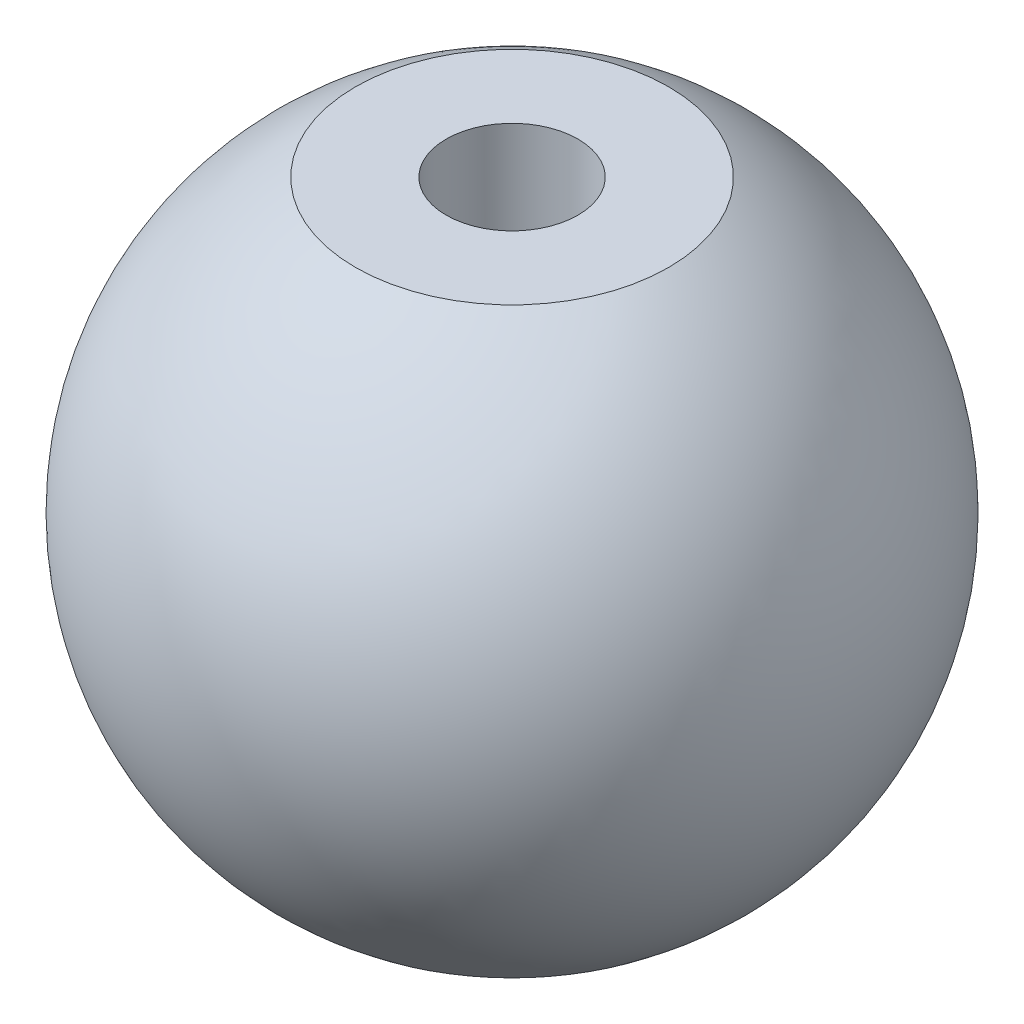
ISO-10303-21;
HEADER;
FILE_DESCRIPTION(('STEP AP214'),'2;1');
FILE_NAME('part.step','',(''),(''),'','','');
FILE_SCHEMA(('AUTOMOTIVE_DESIGN { 1 0 10303 214 1 1 1 1 }'));
ENDSEC;
DATA;
#1=APPLICATION_CONTEXT('core data for automotive mechanical design processes');
#2=APPLICATION_PROTOCOL_DEFINITION('international standard','automotive_design',2000,#1);
#3=PRODUCT_CONTEXT('',#1,'mechanical');
#4=PRODUCT('Part','Part','',(#3));
#5=PRODUCT_RELATED_PRODUCT_CATEGORY('part','',(#4));
#6=PRODUCT_DEFINITION_FORMATION('','',#4);
#7=PRODUCT_DEFINITION_CONTEXT('part definition',#1,'design');
#8=PRODUCT_DEFINITION('design','',#6,#7);
#9=PRODUCT_DEFINITION_SHAPE('','',#8);
#10=(LENGTH_UNIT() NAMED_UNIT(*) SI_UNIT(.MILLI.,.METRE.));
#11=(NAMED_UNIT(*) PLANE_ANGLE_UNIT() SI_UNIT($,.RADIAN.));
#12=(NAMED_UNIT(*) SI_UNIT($,.STERADIAN.) SOLID_ANGLE_UNIT());
#13=UNCERTAINTY_MEASURE_WITH_UNIT(LENGTH_MEASURE(1.E-05),#10,'distance_accuracy_value','');
#14=(GEOMETRIC_REPRESENTATION_CONTEXT(3) GLOBAL_UNCERTAINTY_ASSIGNED_CONTEXT((#13)) GLOBAL_UNIT_ASSIGNED_CONTEXT((#10,
#11,#12)) REPRESENTATION_CONTEXT('',''));
#15=CARTESIAN_POINT('',(0.,0.,0.));
#16=DIRECTION('',(0.,0.,1.));
#17=DIRECTION('',(1.,0.,0.));
#18=AXIS2_PLACEMENT_3D('',#15,#16,#17);
#19=CARTESIAN_POINT('',(0.,12.5,0.));
#20=DIRECTION('',(0.,1.,0.));
#21=DIRECTION('',(0.,0.,1.));
#22=AXIS2_PLACEMENT_3D('',#19,#20,#21);
#23=CYLINDRICAL_SURFACE('',#22,2.5);
#24=CARTESIAN_POINT('',(0.,11.,0.));
#25=DIRECTION('',(0.,-1.,0.));
#26=DIRECTION('',(0.,0.,-1.));
#27=AXIS2_PLACEMENT_3D('',#24,#25,#26);
#28=CIRCLE('',#27,2.5);
#29=CARTESIAN_POINT('',(0.,11.,-2.5));
#30=VERTEX_POINT('',#29);
#31=EDGE_CURVE('E52',#30,#30,#28,.F.);
#32=ORIENTED_EDGE('',*,*,#31,.T.);
#33=EDGE_LOOP('',(#32));
#34=FACE_BOUND('',#33,.T.);
#35=CARTESIAN_POINT('',(0.,-7.5,0.));
#36=DIRECTION('',(0.,1.,0.));
#37=DIRECTION('',(0.,0.,1.));
#38=AXIS2_PLACEMENT_3D('',#35,#36,#37);
#39=CIRCLE('',#38,2.49999999999999);
#40=CARTESIAN_POINT('',(0.,-7.5,2.49999999999999));
#41=VERTEX_POINT('',#40);
#42=EDGE_CURVE('E13',#41,#41,#39,.T.);
#43=ORIENTED_EDGE('',*,*,#42,.F.);
#44=EDGE_LOOP('',(#43));
#45=FACE_BOUND('',#44,.T.);
#46=ADVANCED_FACE('F48',(#34,#45),#23,.F.);
#47=CARTESIAN_POINT('',(0.,-7.5,0.));
#48=DIRECTION('',(0.,1.,0.));
#49=DIRECTION('',(0.,0.,1.));
#50=AXIS2_PLACEMENT_3D('',#47,#48,#49);
#51=CONICAL_SURFACE('',#50,2.49999999999999,1.02974425867665);
#52=CARTESIAN_POINT('',(0.,-9.0021515475689,0.));
#53=VERTEX_POINT('',#52);
#54=VERTEX_LOOP('',#53);
#55=FACE_BOUND('',#54,.T.);
#56=ORIENTED_EDGE('',*,*,#42,.T.);
#57=EDGE_LOOP('',(#56));
#58=FACE_BOUND('',#57,.T.);
#59=ADVANCED_FACE('F59',(#55,#58),#51,.F.);
#60=CARTESIAN_POINT('',(-5.93717104351896,11.,-12.5));
#61=DIRECTION('',(0.,-1.,0.));
#62=DIRECTION('',(0.,0.,-1.));
#63=AXIS2_PLACEMENT_3D('',#60,#61,#62);
#64=PLANE('',#63);
#65=ORIENTED_EDGE('',*,*,#31,.F.);
#66=EDGE_LOOP('',(#65));
#67=FACE_BOUND('',#66,.T.);
#68=CARTESIAN_POINT('',(0.,11.,0.));
#69=DIRECTION('',(0.,-1.,0.));
#70=DIRECTION('',(0.,0.,-1.));
#71=AXIS2_PLACEMENT_3D('',#68,#69,#70);
#72=CIRCLE('',#71,5.93717104351896);
#73=CARTESIAN_POINT('',(0.,11.,-5.93717104351896));
#74=VERTEX_POINT('',#73);
#75=EDGE_CURVE('E56',#74,#74,#72,.T.);
#76=ORIENTED_EDGE('',*,*,#75,.F.);
#77=EDGE_LOOP('',(#76));
#78=FACE_BOUND('',#77,.T.);
#79=ADVANCED_FACE('F62',(#67,#78),#64,.F.);
#80=CARTESIAN_POINT('',(0.,0.,0.));
#81=DIRECTION('',(0.,1.,0.));
#82=DIRECTION('',(-1.,0.,0.));
#83=AXIS2_PLACEMENT_3D('',#80,#81,#82);
#84=SPHERICAL_SURFACE('',#83,12.5);
#85=ORIENTED_EDGE('',*,*,#75,.T.);
#86=EDGE_LOOP('',(#85));
#87=FACE_BOUND('',#86,.T.);
#88=ADVANCED_FACE('F50',(#87),#84,.T.);
#89=CLOSED_SHELL('',(#46,#59,#79,#88));
#90=MANIFOLD_SOLID_BREP('B2',#89);
#91=ADVANCED_BREP_SHAPE_REPRESENTATION('',(#18,#90),#14);
#92=SHAPE_DEFINITION_REPRESENTATION(#9,#91);
ENDSEC;
END-ISO-10303-21;
